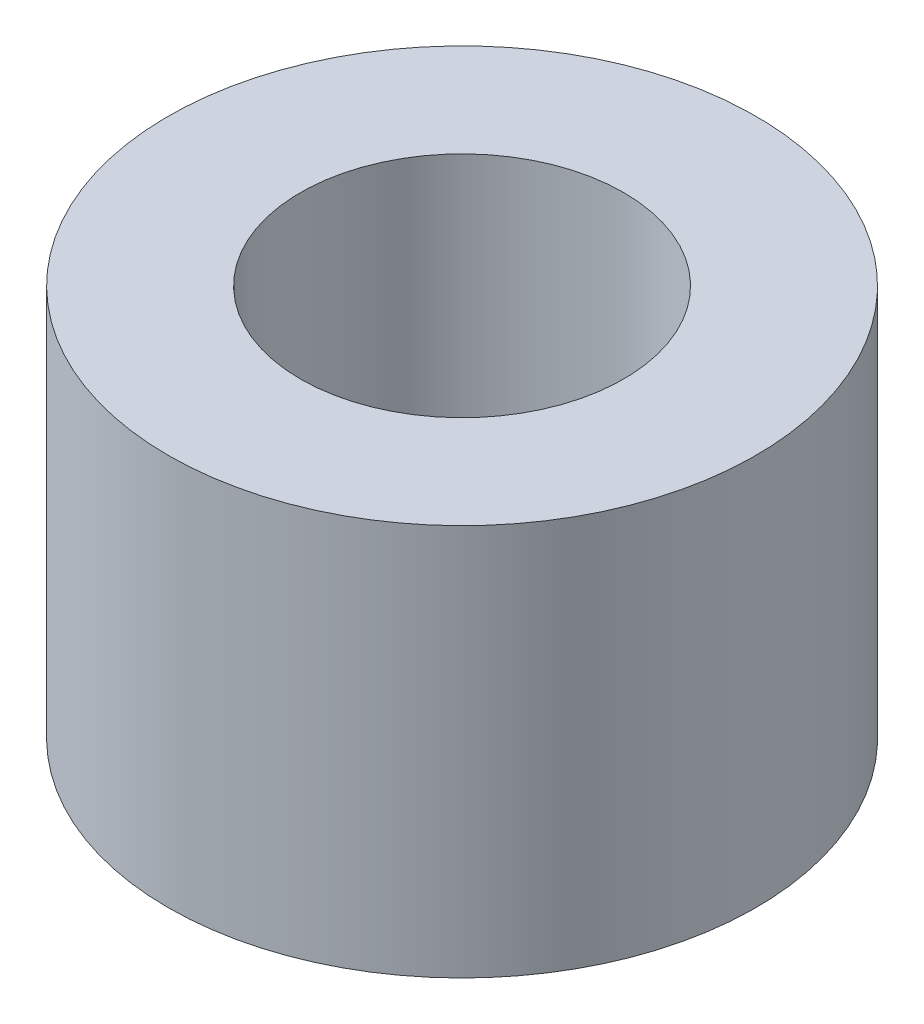
ISO-10303-21;
HEADER;
FILE_DESCRIPTION(('STEP AP214'),'2;1');
FILE_NAME('part.step','',(''),(''),'','','');
FILE_SCHEMA(('AUTOMOTIVE_DESIGN { 1 0 10303 214 1 1 1 1 }'));
ENDSEC;
DATA;
#1=APPLICATION_CONTEXT('core data for automotive mechanical design processes');
#2=APPLICATION_PROTOCOL_DEFINITION('international standard','automotive_design',2000,#1);
#3=PRODUCT_CONTEXT('',#1,'mechanical');
#4=PRODUCT('Part','Part','',(#3));
#5=PRODUCT_RELATED_PRODUCT_CATEGORY('part','',(#4));
#6=PRODUCT_DEFINITION_FORMATION('','',#4);
#7=PRODUCT_DEFINITION_CONTEXT('part definition',#1,'design');
#8=PRODUCT_DEFINITION('design','',#6,#7);
#9=PRODUCT_DEFINITION_SHAPE('','',#8);
#10=(LENGTH_UNIT() NAMED_UNIT(*) SI_UNIT(.MILLI.,.METRE.));
#11=(NAMED_UNIT(*) PLANE_ANGLE_UNIT() SI_UNIT($,.RADIAN.));
#12=(NAMED_UNIT(*) SI_UNIT($,.STERADIAN.) SOLID_ANGLE_UNIT());
#13=UNCERTAINTY_MEASURE_WITH_UNIT(LENGTH_MEASURE(1.E-05),#10,'distance_accuracy_value','');
#14=(GEOMETRIC_REPRESENTATION_CONTEXT(3) GLOBAL_UNCERTAINTY_ASSIGNED_CONTEXT((#13)) GLOBAL_UNIT_ASSIGNED_CONTEXT((#10,
#11,#12)) REPRESENTATION_CONTEXT('',''));
#15=CARTESIAN_POINT('',(0.,0.,0.));
#16=DIRECTION('',(0.,0.,1.));
#17=DIRECTION('',(1.,0.,0.));
#18=AXIS2_PLACEMENT_3D('',#15,#16,#17);
#19=CARTESIAN_POINT('',(0.,4.,0.));
#20=DIRECTION('',(0.,-1.,0.));
#21=DIRECTION('',(0.,0.,-1.));
#22=AXIS2_PLACEMENT_3D('',#19,#20,#21);
#23=CYLINDRICAL_SURFACE('',#22,3.);
#24=CARTESIAN_POINT('',(0.,4.,0.));
#25=DIRECTION('',(0.,1.,0.));
#26=DIRECTION('',(0.,0.,1.));
#27=AXIS2_PLACEMENT_3D('',#24,#25,#26);
#28=CIRCLE('',#27,3.);
#29=CARTESIAN_POINT('',(0.,4.,3.));
#30=VERTEX_POINT('',#29);
#31=EDGE_CURVE('E10',#30,#30,#28,.T.);
#32=ORIENTED_EDGE('',*,*,#31,.F.);
#33=EDGE_LOOP('',(#32));
#34=FACE_BOUND('',#33,.T.);
#35=CARTESIAN_POINT('',(0.,0.,0.));
#36=DIRECTION('',(0.,1.,0.));
#37=DIRECTION('',(0.,0.,1.));
#38=AXIS2_PLACEMENT_3D('',#35,#36,#37);
#39=CIRCLE('',#38,3.);
#40=CARTESIAN_POINT('',(0.,0.,3.));
#41=VERTEX_POINT('',#40);
#42=EDGE_CURVE('E37',#41,#41,#39,.T.);
#43=ORIENTED_EDGE('',*,*,#42,.T.);
#44=EDGE_LOOP('',(#43));
#45=FACE_BOUND('',#44,.T.);
#46=ADVANCED_FACE('F34',(#34,#45),#23,.T.);
#47=CARTESIAN_POINT('',(0.,4.,0.));
#48=DIRECTION('',(0.,1.,0.));
#49=DIRECTION('',(0.,0.,1.));
#50=AXIS2_PLACEMENT_3D('',#47,#48,#49);
#51=PLANE('',#50);
#52=CARTESIAN_POINT('',(0.,4.,0.));
#53=DIRECTION('',(0.,1.,0.));
#54=DIRECTION('',(0.,0.,1.));
#55=AXIS2_PLACEMENT_3D('',#52,#53,#54);
#56=CIRCLE('',#55,1.65);
#57=CARTESIAN_POINT('',(0.,4.,1.65));
#58=VERTEX_POINT('',#57);
#59=EDGE_CURVE('E48',#58,#58,#56,.T.);
#60=ORIENTED_EDGE('',*,*,#59,.F.);
#61=EDGE_LOOP('',(#60));
#62=FACE_BOUND('',#61,.T.);
#63=ORIENTED_EDGE('',*,*,#31,.T.);
#64=EDGE_LOOP('',(#63));
#65=FACE_BOUND('',#64,.T.);
#66=ADVANCED_FACE('F54',(#62,#65),#51,.T.);
#67=CARTESIAN_POINT('',(0.,0.,0.));
#68=DIRECTION('',(0.,1.,0.));
#69=DIRECTION('',(0.,0.,1.));
#70=AXIS2_PLACEMENT_3D('',#67,#68,#69);
#71=PLANE('',#70);
#72=CARTESIAN_POINT('',(0.,0.,0.));
#73=DIRECTION('',(0.,1.,0.));
#74=DIRECTION('',(0.,0.,1.));
#75=AXIS2_PLACEMENT_3D('',#72,#73,#74);
#76=CIRCLE('',#75,1.65);
#77=CARTESIAN_POINT('',(0.,0.,1.65));
#78=VERTEX_POINT('',#77);
#79=EDGE_CURVE('E44',#78,#78,#76,.T.);
#80=ORIENTED_EDGE('',*,*,#79,.T.);
#81=EDGE_LOOP('',(#80));
#82=FACE_BOUND('',#81,.T.);
#83=ORIENTED_EDGE('',*,*,#42,.F.);
#84=EDGE_LOOP('',(#83));
#85=FACE_BOUND('',#84,.T.);
#86=ADVANCED_FACE('F56',(#82,#85),#71,.F.);
#87=CARTESIAN_POINT('',(0.,4.,0.));
#88=DIRECTION('',(0.,1.,0.));
#89=DIRECTION('',(0.,0.,1.));
#90=AXIS2_PLACEMENT_3D('',#87,#88,#89);
#91=CYLINDRICAL_SURFACE('',#90,1.65);
#92=ORIENTED_EDGE('',*,*,#79,.F.);
#93=EDGE_LOOP('',(#92));
#94=FACE_BOUND('',#93,.T.);
#95=ORIENTED_EDGE('',*,*,#59,.T.);
#96=EDGE_LOOP('',(#95));
#97=FACE_BOUND('',#96,.T.);
#98=ADVANCED_FACE('F52',(#94,#97),#91,.F.);
#99=CLOSED_SHELL('',(#46,#66,#86,#98));
#100=MANIFOLD_SOLID_BREP('B2',#99);
#101=ADVANCED_BREP_SHAPE_REPRESENTATION('',(#18,#100),#14);
#102=SHAPE_DEFINITION_REPRESENTATION(#9,#101);
ENDSEC;
END-ISO-10303-21;
